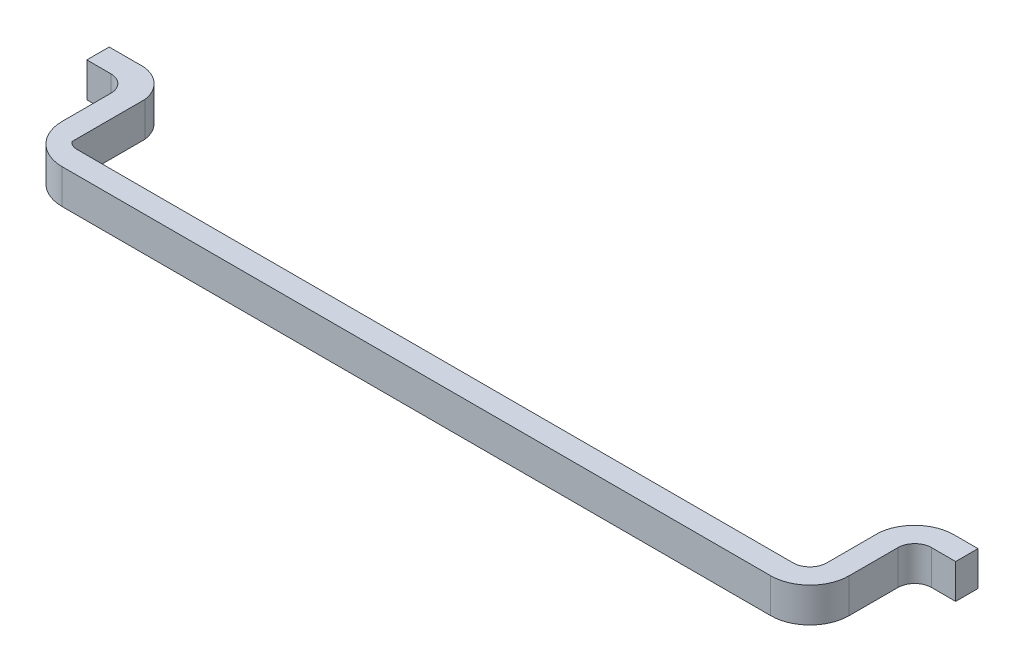
ISO-10303-21;
HEADER;
FILE_DESCRIPTION(('STEP AP214'),'2;1');
FILE_NAME('part.step','',(''),(''),'','','');
FILE_SCHEMA(('AUTOMOTIVE_DESIGN { 1 0 10303 214 1 1 1 1 }'));
ENDSEC;
DATA;
#1=APPLICATION_CONTEXT('core data for automotive mechanical design processes');
#2=APPLICATION_PROTOCOL_DEFINITION('international standard','automotive_design',2000,#1);
#3=PRODUCT_CONTEXT('',#1,'mechanical');
#4=PRODUCT('Part','Part','',(#3));
#5=PRODUCT_RELATED_PRODUCT_CATEGORY('part','',(#4));
#6=PRODUCT_DEFINITION_FORMATION('','',#4);
#7=PRODUCT_DEFINITION_CONTEXT('part definition',#1,'design');
#8=PRODUCT_DEFINITION('design','',#6,#7);
#9=PRODUCT_DEFINITION_SHAPE('','',#8);
#10=(LENGTH_UNIT() NAMED_UNIT(*) SI_UNIT(.MILLI.,.METRE.));
#11=(NAMED_UNIT(*) PLANE_ANGLE_UNIT() SI_UNIT($,.RADIAN.));
#12=(NAMED_UNIT(*) SI_UNIT($,.STERADIAN.) SOLID_ANGLE_UNIT());
#13=UNCERTAINTY_MEASURE_WITH_UNIT(LENGTH_MEASURE(1.E-05),#10,'distance_accuracy_value','');
#14=(GEOMETRIC_REPRESENTATION_CONTEXT(3) GLOBAL_UNCERTAINTY_ASSIGNED_CONTEXT((#13)) GLOBAL_UNIT_ASSIGNED_CONTEXT((#10,
#11,#12)) REPRESENTATION_CONTEXT('',''));
#15=CARTESIAN_POINT('',(0.,0.,0.));
#16=DIRECTION('',(0.,0.,1.));
#17=DIRECTION('',(1.,0.,0.));
#18=AXIS2_PLACEMENT_3D('',#15,#16,#17);
#19=CARTESIAN_POINT('',(36.974920494297,8.449089114766,0.72875));
#20=DIRECTION('',(-1.,0.,0.));
#21=DIRECTION('',(0.,0.,1.));
#22=AXIS2_PLACEMENT_3D('',#19,#20,#21);
#23=PLANE('',#22);
#24=DIRECTION('',(0.,0.,-1.));
#25=VECTOR('',#24,1.);
#26=CARTESIAN_POINT('',(36.974920494297,8.449089114766,1.323992423363));
#27=LINE('',#26,#25);
#28=CARTESIAN_POINT('',(36.974920494297,8.449089114766,1.0425));
#29=VERTEX_POINT('',#28);
#30=CARTESIAN_POINT('',(36.9749205182383,8.449089114766,0.415000215463123));
#31=VERTEX_POINT('',#30);
#32=EDGE_CURVE('E93',#29,#31,#27,.T.);
#33=ORIENTED_EDGE('',*,*,#32,.F.);
#34=DIRECTION('',(0.,-1.,0.));
#35=VECTOR('',#34,1.);
#36=CARTESIAN_POINT('',(36.974920494297,8.449089114766,1.0425));
#37=LINE('',#36,#35);
#38=CARTESIAN_POINT('',(36.974920494297,8.859089114766,1.0425));
#39=VERTEX_POINT('',#38);
#40=EDGE_CURVE('E285',#29,#39,#37,.F.);
#41=ORIENTED_EDGE('',*,*,#40,.T.);
#42=DIRECTION('',(0.,0.,-1.));
#43=VECTOR('',#42,1.);
#44=CARTESIAN_POINT('',(36.974920494297,8.859089114766,1.323992423363));
#45=LINE('',#44,#43);
#46=CARTESIAN_POINT('',(36.9749205182383,8.859089114766,0.415000215463123));
#47=VERTEX_POINT('',#46);
#48=EDGE_CURVE('E318',#39,#47,#45,.T.);
#49=ORIENTED_EDGE('',*,*,#48,.T.);
#50=DIRECTION('',(0.,-1.,0.));
#51=VECTOR('',#50,1.);
#52=CARTESIAN_POINT('',(36.9749205421796,8.449089114766,0.415000005458832));
#53=LINE('',#52,#51);
#54=EDGE_CURVE('E148',#31,#47,#53,.F.);
#55=ORIENTED_EDGE('',*,*,#54,.F.);
#56=EDGE_LOOP('',(#33,#41,#49,#55));
#57=FACE_BOUND('',#56,.T.);
#58=ADVANCED_FACE('F17',(#57),#23,.T.);
#59=CARTESIAN_POINT('',(37.439920494297,8.449089114766,0.468012048193));
#60=DIRECTION('',(0.,-1.,0.));
#61=DIRECTION('',(0.,0.,-1.));
#62=AXIS2_PLACEMENT_3D('',#59,#60,#61);
#63=CYLINDRICAL_SURFACE('',#62,0.468012);
#64=CARTESIAN_POINT('',(37.439920494297,8.449089114766,0.468012048193));
#65=DIRECTION('',(0.,-1.,0.));
#66=DIRECTION('',(0.,0.,-1.));
#67=AXIS2_PLACEMENT_3D('',#64,#65,#66);
#68=CIRCLE('',#67,0.468012);
#69=CARTESIAN_POINT('',(37.439920494297,8.449089114766,0.));
#70=VERTEX_POINT('',#69);
#71=EDGE_CURVE('E20',#31,#70,#68,.T.);
#72=ORIENTED_EDGE('',*,*,#71,.F.);
#73=ORIENTED_EDGE('',*,*,#54,.T.);
#74=CARTESIAN_POINT('',(37.439920494297,8.859089114766,0.468012048193));
#75=DIRECTION('',(0.,-1.,0.));
#76=DIRECTION('',(0.,0.,-1.));
#77=AXIS2_PLACEMENT_3D('',#74,#75,#76);
#78=CIRCLE('',#77,0.468012);
#79=CARTESIAN_POINT('',(37.439920494297,8.859089114766,0.));
#80=VERTEX_POINT('',#79);
#81=EDGE_CURVE('E316',#47,#80,#78,.T.);
#82=ORIENTED_EDGE('',*,*,#81,.T.);
#83=DIRECTION('',(0.,1.,0.));
#84=VECTOR('',#83,1.);
#85=CARTESIAN_POINT('',(37.439920494297,8.449089114766,0.));
#86=LINE('',#85,#84);
#87=EDGE_CURVE('E153',#80,#70,#86,.F.);
#88=ORIENTED_EDGE('',*,*,#87,.T.);
#89=EDGE_LOOP('',(#72,#73,#82,#88));
#90=FACE_BOUND('',#89,.T.);
#91=ADVANCED_FACE('F403',(#90),#63,.T.);
#92=CARTESIAN_POINT('',(37.582420494297,8.449089114766,0.));
#93=DIRECTION('',(0.,0.,1.));
#94=DIRECTION('',(1.,0.,0.));
#95=AXIS2_PLACEMENT_3D('',#92,#93,#94);
#96=PLANE('',#95);
#97=DIRECTION('',(0.,1.,0.));
#98=VECTOR('',#97,1.);
#99=CARTESIAN_POINT('',(37.724920494297,8.449089114766,0.));
#100=LINE('',#99,#98);
#101=CARTESIAN_POINT('',(37.724920494297,8.449089114766,0.));
#102=VERTEX_POINT('',#101);
#103=CARTESIAN_POINT('',(37.724920494297,8.859089114766,0.));
#104=VERTEX_POINT('',#103);
#105=EDGE_CURVE('E159',#102,#104,#100,.T.);
#106=ORIENTED_EDGE('',*,*,#105,.F.);
#107=DIRECTION('',(1.,0.,0.));
#108=VECTOR('',#107,1.);
#109=CARTESIAN_POINT('',(32.574920494297,8.449089114766,0.));
#110=LINE('',#109,#108);
#111=EDGE_CURVE('E102',#70,#102,#110,.T.);
#112=ORIENTED_EDGE('',*,*,#111,.F.);
#113=ORIENTED_EDGE('',*,*,#87,.F.);
#114=DIRECTION('',(1.,0.,0.));
#115=VECTOR('',#114,1.);
#116=CARTESIAN_POINT('',(32.574920494297,8.859089114766,0.));
#117=LINE('',#116,#115);
#118=EDGE_CURVE('E277',#80,#104,#117,.T.);
#119=ORIENTED_EDGE('',*,*,#118,.T.);
#120=EDGE_LOOP('',(#106,#112,#113,#119));
#121=FACE_BOUND('',#120,.T.);
#122=ADVANCED_FACE('F404',(#121),#96,.F.);
#123=CARTESIAN_POINT('',(37.724920494297,8.449089114766,0.1325));
#124=DIRECTION('',(1.,0.,0.));
#125=DIRECTION('',(0.,0.,-1.));
#126=AXIS2_PLACEMENT_3D('',#123,#124,#125);
#127=PLANE('',#126);
#128=DIRECTION('',(0.,0.,-1.));
#129=VECTOR('',#128,1.);
#130=CARTESIAN_POINT('',(37.724920494297,8.449089114766,1.323992423363));
#131=LINE('',#130,#129);
#132=CARTESIAN_POINT('',(37.724920494297,8.449089114766,0.265));
#133=VERTEX_POINT('',#132);
#134=EDGE_CURVE('E226',#102,#133,#131,.F.);
#135=ORIENTED_EDGE('',*,*,#134,.F.);
#136=ORIENTED_EDGE('',*,*,#105,.T.);
#137=DIRECTION('',(0.,0.,-1.));
#138=VECTOR('',#137,1.);
#139=CARTESIAN_POINT('',(37.724920494297,8.859089114766,1.323992423363));
#140=LINE('',#139,#138);
#141=CARTESIAN_POINT('',(37.724920494297,8.859089114766,0.265));
#142=VERTEX_POINT('',#141);
#143=EDGE_CURVE('E274',#104,#142,#140,.F.);
#144=ORIENTED_EDGE('',*,*,#143,.T.);
#145=DIRECTION('',(0.,1.,0.));
#146=VECTOR('',#145,1.);
#147=CARTESIAN_POINT('',(37.724920494297,8.449089114766,0.265));
#148=LINE('',#147,#146);
#149=EDGE_CURVE('E167',#133,#142,#148,.T.);
#150=ORIENTED_EDGE('',*,*,#149,.F.);
#151=EDGE_LOOP('',(#135,#136,#144,#150));
#152=FACE_BOUND('',#151,.T.);
#153=ADVANCED_FACE('F405',(#152),#127,.T.);
#154=CARTESIAN_POINT('',(37.582420494297,8.449089114766,0.265));
#155=DIRECTION('',(0.,0.,1.));
#156=DIRECTION('',(1.,0.,0.));
#157=AXIS2_PLACEMENT_3D('',#154,#155,#156);
#158=PLANE('',#157);
#159=DIRECTION('',(1.,0.,0.));
#160=VECTOR('',#159,1.);
#161=CARTESIAN_POINT('',(32.574920494297,8.449089114766,0.265));
#162=LINE('',#161,#160);
#163=CARTESIAN_POINT('',(37.439920494297,8.449089114766,0.265));
#164=VERTEX_POINT('',#163);
#165=EDGE_CURVE('E224',#133,#164,#162,.F.);
#166=ORIENTED_EDGE('',*,*,#165,.F.);
#167=ORIENTED_EDGE('',*,*,#149,.T.);
#168=DIRECTION('',(1.,0.,0.));
#169=VECTOR('',#168,1.);
#170=CARTESIAN_POINT('',(32.574920494297,8.859089114766,0.265));
#171=LINE('',#170,#169);
#172=CARTESIAN_POINT('',(37.439920494297,8.859089114766,0.265));
#173=VERTEX_POINT('',#172);
#174=EDGE_CURVE('E276',#142,#173,#171,.F.);
#175=ORIENTED_EDGE('',*,*,#174,.T.);
#176=DIRECTION('',(0.,-1.,0.));
#177=VECTOR('',#176,1.);
#178=CARTESIAN_POINT('',(37.439920494297,8.449089114766,0.265));
#179=LINE('',#178,#177);
#180=EDGE_CURVE('E268',#173,#164,#179,.T.);
#181=ORIENTED_EDGE('',*,*,#180,.T.);
#182=EDGE_LOOP('',(#166,#167,#175,#181));
#183=FACE_BOUND('',#182,.T.);
#184=ADVANCED_FACE('F406',(#183),#158,.T.);
#185=CARTESIAN_POINT('',(37.439920494297,8.449089114766,0.465));
#186=DIRECTION('',(0.,-1.,0.));
#187=DIRECTION('',(0.,0.,-1.));
#188=AXIS2_PLACEMENT_3D('',#185,#186,#187);
#189=CYLINDRICAL_SURFACE('',#188,0.2);
#190=DIRECTION('',(0.,1.,0.));
#191=VECTOR('',#190,1.);
#192=CARTESIAN_POINT('',(37.239920494297,8.449089114766,0.465));
#193=LINE('',#192,#191);
#194=CARTESIAN_POINT('',(37.239920494297,8.449089114766,0.465));
#195=VERTEX_POINT('',#194);
#196=CARTESIAN_POINT('',(37.239920494297,8.859089114766,0.465));
#197=VERTEX_POINT('',#196);
#198=EDGE_CURVE('E266',#195,#197,#193,.T.);
#199=ORIENTED_EDGE('',*,*,#198,.F.);
#200=CARTESIAN_POINT('',(37.439920494297,8.449089114766,0.465));
#201=DIRECTION('',(0.,-1.,0.));
#202=DIRECTION('',(0.,0.,-1.));
#203=AXIS2_PLACEMENT_3D('',#200,#201,#202);
#204=CIRCLE('',#203,0.2);
#205=EDGE_CURVE('E223',#164,#195,#204,.F.);
#206=ORIENTED_EDGE('',*,*,#205,.F.);
#207=ORIENTED_EDGE('',*,*,#180,.F.);
#208=CARTESIAN_POINT('',(37.439920494297,8.859089114766,0.465));
#209=DIRECTION('',(0.,-1.,0.));
#210=DIRECTION('',(0.,0.,-1.));
#211=AXIS2_PLACEMENT_3D('',#208,#209,#210);
#212=CIRCLE('',#211,0.2);
#213=EDGE_CURVE('E313',#173,#197,#212,.F.);
#214=ORIENTED_EDGE('',*,*,#213,.T.);
#215=EDGE_LOOP('',(#199,#206,#207,#214));
#216=FACE_BOUND('',#215,.T.);
#217=ADVANCED_FACE('F330',(#216),#189,.F.);
#218=CARTESIAN_POINT('',(37.239920494297,8.449089114766,0.75375));
#219=DIRECTION('',(1.,0.,0.));
#220=DIRECTION('',(0.,0.,-1.));
#221=AXIS2_PLACEMENT_3D('',#218,#219,#220);
#222=PLANE('',#221);
#223=DIRECTION('',(0.,0.,-1.));
#224=VECTOR('',#223,1.);
#225=CARTESIAN_POINT('',(37.239920494297,8.449089114766,1.323992423363));
#226=LINE('',#225,#224);
#227=CARTESIAN_POINT('',(37.239920494297,8.449089114766,1.0425));
#228=VERTEX_POINT('',#227);
#229=EDGE_CURVE('E221',#195,#228,#226,.F.);
#230=ORIENTED_EDGE('',*,*,#229,.F.);
#231=ORIENTED_EDGE('',*,*,#198,.T.);
#232=DIRECTION('',(0.,0.,-1.));
#233=VECTOR('',#232,1.);
#234=CARTESIAN_POINT('',(37.239920494297,8.859089114766,1.323992423363));
#235=LINE('',#234,#233);
#236=CARTESIAN_POINT('',(37.239920494297,8.859089114766,1.0425));
#237=VERTEX_POINT('',#236);
#238=EDGE_CURVE('E312',#197,#237,#235,.F.);
#239=ORIENTED_EDGE('',*,*,#238,.T.);
#240=DIRECTION('',(0.,-1.,0.));
#241=VECTOR('',#240,1.);
#242=CARTESIAN_POINT('',(37.239920494297,8.449089114766,1.0425));
#243=LINE('',#242,#241);
#244=EDGE_CURVE('E264',#228,#237,#243,.F.);
#245=ORIENTED_EDGE('',*,*,#244,.F.);
#246=EDGE_LOOP('',(#230,#231,#239,#245));
#247=FACE_BOUND('',#246,.T.);
#248=ADVANCED_FACE('F335',(#247),#222,.T.);
#249=CARTESIAN_POINT('',(36.774920494297,8.449089114766,1.0425));
#250=DIRECTION('',(0.,-1.,0.));
#251=DIRECTION('',(0.,0.,-1.));
#252=AXIS2_PLACEMENT_3D('',#249,#250,#251);
#253=CYLINDRICAL_SURFACE('',#252,0.465);
#254=CARTESIAN_POINT('',(36.774920494297,8.449089114766,1.0425));
#255=DIRECTION('',(0.,-1.,0.));
#256=DIRECTION('',(0.,0.,-1.));
#257=AXIS2_PLACEMENT_3D('',#254,#255,#256);
#258=CIRCLE('',#257,0.465);
#259=CARTESIAN_POINT('',(36.774920494297,8.449089114766,1.5075));
#260=VERTEX_POINT('',#259);
#261=EDGE_CURVE('E220',#228,#260,#258,.T.);
#262=ORIENTED_EDGE('',*,*,#261,.F.);
#263=ORIENTED_EDGE('',*,*,#244,.T.);
#264=CARTESIAN_POINT('',(36.774920494297,8.859089114766,1.0425));
#265=DIRECTION('',(0.,-1.,0.));
#266=DIRECTION('',(0.,0.,-1.));
#267=AXIS2_PLACEMENT_3D('',#264,#265,#266);
#268=CIRCLE('',#267,0.465);
#269=CARTESIAN_POINT('',(36.774920494297,8.859089114766,1.5075));
#270=VERTEX_POINT('',#269);
#271=EDGE_CURVE('E309',#237,#270,#268,.T.);
#272=ORIENTED_EDGE('',*,*,#271,.T.);
#273=DIRECTION('',(0.,1.,0.));
#274=VECTOR('',#273,1.);
#275=CARTESIAN_POINT('',(36.774920494297,8.449089114766,1.5075));
#276=LINE('',#275,#274);
#277=EDGE_CURVE('E261',#270,#260,#276,.F.);
#278=ORIENTED_EDGE('',*,*,#277,.T.);
#279=EDGE_LOOP('',(#262,#263,#272,#278));
#280=FACE_BOUND('',#279,.T.);
#281=ADVANCED_FACE('F339',(#280),#253,.T.);
#282=CARTESIAN_POINT('',(30.699920494297,8.449089114766,1.5075));
#283=DIRECTION('',(0.,0.,-1.));
#284=DIRECTION('',(-1.,0.,0.));
#285=AXIS2_PLACEMENT_3D('',#282,#283,#284);
#286=PLANE('',#285);
#287=DIRECTION('',(0.,-1.,0.));
#288=VECTOR('',#287,1.);
#289=CARTESIAN_POINT('',(28.374920494297,8.449089114766,1.5075));
#290=LINE('',#289,#288);
#291=CARTESIAN_POINT('',(28.374920494297,8.449089114766,1.5075));
#292=VERTEX_POINT('',#291);
#293=CARTESIAN_POINT('',(28.374920494297,8.859089114766,1.5075));
#294=VERTEX_POINT('',#293);
#295=EDGE_CURVE('E259',#292,#294,#290,.F.);
#296=ORIENTED_EDGE('',*,*,#295,.F.);
#297=DIRECTION('',(1.,0.,0.));
#298=VECTOR('',#297,1.);
#299=CARTESIAN_POINT('',(32.574920494297,8.449089114766,1.5075));
#300=LINE('',#299,#298);
#301=EDGE_CURVE('E218',#260,#292,#300,.F.);
#302=ORIENTED_EDGE('',*,*,#301,.F.);
#303=ORIENTED_EDGE('',*,*,#277,.F.);
#304=DIRECTION('',(1.,0.,0.));
#305=VECTOR('',#304,1.);
#306=CARTESIAN_POINT('',(32.574920494297,8.859089114766,1.5075));
#307=LINE('',#306,#305);
#308=EDGE_CURVE('E308',#270,#294,#307,.F.);
#309=ORIENTED_EDGE('',*,*,#308,.T.);
#310=EDGE_LOOP('',(#296,#302,#303,#309));
#311=FACE_BOUND('',#310,.T.);
#312=ADVANCED_FACE('F345',(#311),#286,.F.);
#313=CARTESIAN_POINT('',(28.374920494297,8.449089114766,1.0425));
#314=DIRECTION('',(0.,-1.,0.));
#315=DIRECTION('',(0.,0.,-1.));
#316=AXIS2_PLACEMENT_3D('',#313,#314,#315);
#317=CYLINDRICAL_SURFACE('',#316,0.465);
#318=CARTESIAN_POINT('',(28.374920494297,8.449089114766,1.0425));
#319=DIRECTION('',(0.,-1.,0.));
#320=DIRECTION('',(0.,0.,-1.));
#321=AXIS2_PLACEMENT_3D('',#318,#319,#320);
#322=CIRCLE('',#321,0.465);
#323=CARTESIAN_POINT('',(27.909920494297,8.449089114766,1.0425));
#324=VERTEX_POINT('',#323);
#325=EDGE_CURVE('E217',#292,#324,#322,.T.);
#326=ORIENTED_EDGE('',*,*,#325,.F.);
#327=ORIENTED_EDGE('',*,*,#295,.T.);
#328=CARTESIAN_POINT('',(28.374920494297,8.859089114766,1.0425));
#329=DIRECTION('',(0.,-1.,0.));
#330=DIRECTION('',(0.,0.,-1.));
#331=AXIS2_PLACEMENT_3D('',#328,#329,#330);
#332=CIRCLE('',#331,0.465);
#333=CARTESIAN_POINT('',(27.909920494297,8.859089114766,1.0425));
#334=VERTEX_POINT('',#333);
#335=EDGE_CURVE('E305',#294,#334,#332,.T.);
#336=ORIENTED_EDGE('',*,*,#335,.T.);
#337=DIRECTION('',(0.,1.,0.));
#338=VECTOR('',#337,1.);
#339=CARTESIAN_POINT('',(27.909920494297,8.449089114766,1.0425));
#340=LINE('',#339,#338);
#341=EDGE_CURVE('E256',#334,#324,#340,.F.);
#342=ORIENTED_EDGE('',*,*,#341,.T.);
#343=EDGE_LOOP('',(#326,#327,#336,#342));
#344=FACE_BOUND('',#343,.T.);
#345=ADVANCED_FACE('F349',(#344),#317,.T.);
#346=CARTESIAN_POINT('',(27.909920494297,8.449089114766,0.75375));
#347=DIRECTION('',(1.,0.,0.));
#348=DIRECTION('',(0.,0.,-1.));
#349=AXIS2_PLACEMENT_3D('',#346,#347,#348);
#350=PLANE('',#349);
#351=DIRECTION('',(0.,-1.,0.));
#352=VECTOR('',#351,1.);
#353=CARTESIAN_POINT('',(27.909920494297,8.449089114766,0.465));
#354=LINE('',#353,#352);
#355=CARTESIAN_POINT('',(27.909920494297,8.859089114766,0.465));
#356=VERTEX_POINT('',#355);
#357=CARTESIAN_POINT('',(27.909920494297,8.449089114766,0.465));
#358=VERTEX_POINT('',#357);
#359=EDGE_CURVE('E253',#356,#358,#354,.T.);
#360=ORIENTED_EDGE('',*,*,#359,.T.);
#361=DIRECTION('',(0.,0.,-1.));
#362=VECTOR('',#361,1.);
#363=CARTESIAN_POINT('',(27.909920494297,8.449089114766,1.323992423363));
#364=LINE('',#363,#362);
#365=EDGE_CURVE('E215',#324,#358,#364,.T.);
#366=ORIENTED_EDGE('',*,*,#365,.F.);
#367=ORIENTED_EDGE('',*,*,#341,.F.);
#368=DIRECTION('',(0.,0.,-1.));
#369=VECTOR('',#368,1.);
#370=CARTESIAN_POINT('',(27.909920494297,8.859089114766,1.323992423363));
#371=LINE('',#370,#369);
#372=EDGE_CURVE('E304',#334,#356,#371,.T.);
#373=ORIENTED_EDGE('',*,*,#372,.T.);
#374=EDGE_LOOP('',(#360,#366,#367,#373));
#375=FACE_BOUND('',#374,.T.);
#376=ADVANCED_FACE('F354',(#375),#350,.F.);
#377=CARTESIAN_POINT('',(27.709920494297,8.449089114766,0.465));
#378=DIRECTION('',(0.,-1.,0.));
#379=DIRECTION('',(0.,0.,-1.));
#380=AXIS2_PLACEMENT_3D('',#377,#378,#379);
#381=CYLINDRICAL_SURFACE('',#380,0.2);
#382=DIRECTION('',(0.,1.,0.));
#383=VECTOR('',#382,1.);
#384=CARTESIAN_POINT('',(27.709920494297,8.449089114766,0.265));
#385=LINE('',#384,#383);
#386=CARTESIAN_POINT('',(27.709920494297,8.859089114766,0.265));
#387=VERTEX_POINT('',#386);
#388=CARTESIAN_POINT('',(27.709920494297,8.449089114766,0.265));
#389=VERTEX_POINT('',#388);
#390=EDGE_CURVE('E248',#387,#389,#385,.F.);
#391=ORIENTED_EDGE('',*,*,#390,.T.);
#392=CARTESIAN_POINT('',(27.709920494297,8.449089114766,0.465));
#393=DIRECTION('',(0.,-1.,0.));
#394=DIRECTION('',(0.,0.,-1.));
#395=AXIS2_PLACEMENT_3D('',#392,#393,#394);
#396=CIRCLE('',#395,0.2);
#397=EDGE_CURVE('E212',#358,#389,#396,.F.);
#398=ORIENTED_EDGE('',*,*,#397,.F.);
#399=ORIENTED_EDGE('',*,*,#359,.F.);
#400=CARTESIAN_POINT('',(27.709920494297,8.859089114766,0.465));
#401=DIRECTION('',(0.,-1.,0.));
#402=DIRECTION('',(0.,0.,-1.));
#403=AXIS2_PLACEMENT_3D('',#400,#401,#402);
#404=CIRCLE('',#403,0.2);
#405=EDGE_CURVE('E301',#356,#387,#404,.F.);
#406=ORIENTED_EDGE('',*,*,#405,.T.);
#407=EDGE_LOOP('',(#391,#398,#399,#406));
#408=FACE_BOUND('',#407,.T.);
#409=ADVANCED_FACE('F357',(#408),#381,.F.);
#410=CARTESIAN_POINT('',(27.567420494297,8.449089114766,0.265));
#411=DIRECTION('',(0.,0.,-1.));
#412=DIRECTION('',(-1.,0.,0.));
#413=AXIS2_PLACEMENT_3D('',#410,#411,#412);
#414=PLANE('',#413);
#415=DIRECTION('',(0.,1.,0.));
#416=VECTOR('',#415,1.);
#417=CARTESIAN_POINT('',(27.424920494297,8.449089114766,0.265));
#418=LINE('',#417,#416);
#419=CARTESIAN_POINT('',(27.424920494297,8.859089114766,0.265));
#420=VERTEX_POINT('',#419);
#421=CARTESIAN_POINT('',(27.424920494297,8.449089114766,0.265));
#422=VERTEX_POINT('',#421);
#423=EDGE_CURVE('E198',#420,#422,#418,.F.);
#424=ORIENTED_EDGE('',*,*,#423,.T.);
#425=DIRECTION('',(1.,0.,0.));
#426=VECTOR('',#425,1.);
#427=CARTESIAN_POINT('',(32.574920494297,8.449089114766,0.265));
#428=LINE('',#427,#426);
#429=EDGE_CURVE('E185',#389,#422,#428,.F.);
#430=ORIENTED_EDGE('',*,*,#429,.F.);
#431=ORIENTED_EDGE('',*,*,#390,.F.);
#432=DIRECTION('',(1.,0.,0.));
#433=VECTOR('',#432,1.);
#434=CARTESIAN_POINT('',(32.574920494297,8.859089114766,0.265));
#435=LINE('',#434,#433);
#436=EDGE_CURVE('E244',#387,#420,#435,.F.);
#437=ORIENTED_EDGE('',*,*,#436,.T.);
#438=EDGE_LOOP('',(#424,#430,#431,#437));
#439=FACE_BOUND('',#438,.T.);
#440=ADVANCED_FACE('F362',(#439),#414,.F.);
#441=CARTESIAN_POINT('',(27.424920494297,8.449089114766,0.1325));
#442=DIRECTION('',(1.,0.,0.));
#443=DIRECTION('',(0.,0.,-1.));
#444=AXIS2_PLACEMENT_3D('',#441,#442,#443);
#445=PLANE('',#444);
#446=DIRECTION('',(0.,1.,0.));
#447=VECTOR('',#446,1.);
#448=CARTESIAN_POINT('',(27.424920494297,8.449089114766,0.));
#449=LINE('',#448,#447);
#450=CARTESIAN_POINT('',(27.424920494297,8.859089114766,0.));
#451=VERTEX_POINT('',#450);
#452=CARTESIAN_POINT('',(27.424920494297,8.449089114766,0.));
#453=VERTEX_POINT('',#452);
#454=EDGE_CURVE('E190',#451,#453,#449,.F.);
#455=ORIENTED_EDGE('',*,*,#454,.T.);
#456=DIRECTION('',(0.,0.,-1.));
#457=VECTOR('',#456,1.);
#458=CARTESIAN_POINT('',(27.424920494297,8.449089114766,1.323992423363));
#459=LINE('',#458,#457);
#460=EDGE_CURVE('E178',#422,#453,#459,.T.);
#461=ORIENTED_EDGE('',*,*,#460,.F.);
#462=ORIENTED_EDGE('',*,*,#423,.F.);
#463=DIRECTION('',(0.,0.,-1.));
#464=VECTOR('',#463,1.);
#465=CARTESIAN_POINT('',(27.424920494297,8.859089114766,1.323992423363));
#466=LINE('',#465,#464);
#467=EDGE_CURVE('E193',#420,#451,#466,.T.);
#468=ORIENTED_EDGE('',*,*,#467,.T.);
#469=EDGE_LOOP('',(#455,#461,#462,#468));
#470=FACE_BOUND('',#469,.T.);
#471=ADVANCED_FACE('F191',(#470),#445,.F.);
#472=CARTESIAN_POINT('',(27.592420494297,8.449089114766,0.));
#473=DIRECTION('',(0.,0.,1.));
#474=DIRECTION('',(1.,0.,0.));
#475=AXIS2_PLACEMENT_3D('',#472,#473,#474);
#476=PLANE('',#475);
#477=DIRECTION('',(0.,-1.,0.));
#478=VECTOR('',#477,1.);
#479=CARTESIAN_POINT('',(27.7599204958936,8.449089114766,1.54309199966451E-08));
#480=LINE('',#479,#478);
#481=CARTESIAN_POINT('',(27.7599205704648,8.449089114766,7.71545999832257E-09));
#482=VERTEX_POINT('',#481);
#483=CARTESIAN_POINT('',(27.7599205704648,8.859089114766,7.71545999832257E-09));
#484=VERTEX_POINT('',#483);
#485=EDGE_CURVE('E197',#482,#484,#480,.F.);
#486=ORIENTED_EDGE('',*,*,#485,.F.);
#487=DIRECTION('',(1.,0.,0.));
#488=VECTOR('',#487,1.);
#489=CARTESIAN_POINT('',(32.574920494297,8.449089114766,0.));
#490=LINE('',#489,#488);
#491=EDGE_CURVE('E182',#453,#482,#490,.T.);
#492=ORIENTED_EDGE('',*,*,#491,.F.);
#493=ORIENTED_EDGE('',*,*,#454,.F.);
#494=DIRECTION('',(1.,0.,0.));
#495=VECTOR('',#494,1.);
#496=CARTESIAN_POINT('',(32.574920494297,8.859089114766,0.));
#497=LINE('',#496,#495);
#498=EDGE_CURVE('E243',#451,#484,#497,.T.);
#499=ORIENTED_EDGE('',*,*,#498,.T.);
#500=EDGE_LOOP('',(#486,#492,#493,#499));
#501=FACE_BOUND('',#500,.T.);
#502=ADVANCED_FACE('F200',(#501),#476,.F.);
#503=CARTESIAN_POINT('',(27.798978002137,8.449089114766,0.377496862239));
#504=DIRECTION('',(0.,-1.,0.));
#505=DIRECTION('',(0.,0.,-1.));
#506=AXIS2_PLACEMENT_3D('',#503,#504,#505);
#507=CYLINDRICAL_SURFACE('',#506,0.379512);
#508=CARTESIAN_POINT('',(27.798978002137,8.449089114766,0.377496862239));
#509=DIRECTION('',(0.,-1.,0.));
#510=DIRECTION('',(0.,0.,-1.));
#511=AXIS2_PLACEMENT_3D('',#508,#509,#510);
#512=CIRCLE('',#511,0.379512);
#513=CARTESIAN_POINT('',(28.174920494297,8.449089114766,0.325568001091064));
#514=VERTEX_POINT('',#513);
#515=EDGE_CURVE('E202',#482,#514,#512,.T.);
#516=ORIENTED_EDGE('',*,*,#515,.F.);
#517=ORIENTED_EDGE('',*,*,#485,.T.);
#518=CARTESIAN_POINT('',(27.798978002137,8.859089114766,0.377496862239));
#519=DIRECTION('',(0.,-1.,0.));
#520=DIRECTION('',(0.,0.,-1.));
#521=AXIS2_PLACEMENT_3D('',#518,#519,#520);
#522=CIRCLE('',#521,0.379512);
#523=CARTESIAN_POINT('',(28.174920494297,8.859089114766,0.325568001091064));
#524=VERTEX_POINT('',#523);
#525=EDGE_CURVE('E298',#484,#524,#522,.T.);
#526=ORIENTED_EDGE('',*,*,#525,.T.);
#527=DIRECTION('',(0.,1.,0.));
#528=VECTOR('',#527,1.);
#529=CARTESIAN_POINT('',(28.174920494297,8.449089114766,0.325567944402));
#530=LINE('',#529,#528);
#531=EDGE_CURVE('E236',#524,#514,#530,.F.);
#532=ORIENTED_EDGE('',*,*,#531,.T.);
#533=EDGE_LOOP('',(#516,#517,#526,#532));
#534=FACE_BOUND('',#533,.T.);
#535=ADVANCED_FACE('F432',(#534),#507,.T.);
#536=CARTESIAN_POINT('',(28.174920494297,8.449089114766,0.759033972201));
#537=DIRECTION('',(-1.,0.,0.));
#538=DIRECTION('',(0.,0.,1.));
#539=AXIS2_PLACEMENT_3D('',#536,#537,#538);
#540=PLANE('',#539);
#541=DIRECTION('',(0.,-1.,0.));
#542=VECTOR('',#541,1.);
#543=CARTESIAN_POINT('',(28.174920494297,8.449089114766,1.1925));
#544=LINE('',#543,#542);
#545=CARTESIAN_POINT('',(28.174920494297,8.859089114766,1.19249999999999));
#546=VERTEX_POINT('',#545);
#547=CARTESIAN_POINT('',(28.174920494297,8.449089114766,1.19249999999999));
#548=VERTEX_POINT('',#547);
#549=EDGE_CURVE('E233',#546,#548,#544,.T.);
#550=ORIENTED_EDGE('',*,*,#549,.T.);
#551=DIRECTION('',(0.,0.,-1.));
#552=VECTOR('',#551,1.);
#553=CARTESIAN_POINT('',(28.174920494297,8.449089114766,1.323992423363));
#554=LINE('',#553,#552);
#555=EDGE_CURVE('E204',#514,#548,#554,.F.);
#556=ORIENTED_EDGE('',*,*,#555,.F.);
#557=ORIENTED_EDGE('',*,*,#531,.F.);
#558=DIRECTION('',(0.,0.,-1.));
#559=VECTOR('',#558,1.);
#560=CARTESIAN_POINT('',(28.174920494297,8.859089114766,1.323992423363));
#561=LINE('',#560,#559);
#562=EDGE_CURVE('E297',#524,#546,#561,.F.);
#563=ORIENTED_EDGE('',*,*,#562,.T.);
#564=EDGE_LOOP('',(#550,#556,#557,#563));
#565=FACE_BOUND('',#564,.T.);
#566=ADVANCED_FACE('F429',(#565),#540,.F.);
#567=CARTESIAN_POINT('',(28.286723893172,8.449089114766,1.0925));
#568=DIRECTION('',(0.,-1.,0.));
#569=DIRECTION('',(0.,0.,-1.));
#570=AXIS2_PLACEMENT_3D('',#567,#568,#569);
#571=CYLINDRICAL_SURFACE('',#570,0.15);
#572=DIRECTION('',(0.,1.,0.));
#573=VECTOR('',#572,1.);
#574=CARTESIAN_POINT('',(28.286723893172,8.449089114766,1.2425));
#575=LINE('',#574,#573);
#576=CARTESIAN_POINT('',(28.286723893172,8.859089114766,1.2425));
#577=VERTEX_POINT('',#576);
#578=CARTESIAN_POINT('',(28.286723893172,8.449089114766,1.2425));
#579=VERTEX_POINT('',#578);
#580=EDGE_CURVE('E296',#577,#579,#575,.F.);
#581=ORIENTED_EDGE('',*,*,#580,.T.);
#582=CARTESIAN_POINT('',(28.286723893172,8.449089114766,1.0925));
#583=DIRECTION('',(0.,-1.,0.));
#584=DIRECTION('',(0.,0.,-1.));
#585=AXIS2_PLACEMENT_3D('',#582,#583,#584);
#586=CIRCLE('',#585,0.15);
#587=EDGE_CURVE('E321',#548,#579,#586,.F.);
#588=ORIENTED_EDGE('',*,*,#587,.F.);
#589=ORIENTED_EDGE('',*,*,#549,.F.);
#590=CARTESIAN_POINT('',(28.286723893172,8.859089114766,1.0925));
#591=DIRECTION('',(0.,-1.,0.));
#592=DIRECTION('',(0.,0.,-1.));
#593=AXIS2_PLACEMENT_3D('',#590,#591,#592);
#594=CIRCLE('',#593,0.15);
#595=EDGE_CURVE('E293',#546,#577,#594,.F.);
#596=ORIENTED_EDGE('',*,*,#595,.T.);
#597=EDGE_LOOP('',(#581,#588,#589,#596));
#598=FACE_BOUND('',#597,.T.);
#599=ADVANCED_FACE('F397',(#598),#571,.F.);
#600=CARTESIAN_POINT('',(32.574920494297,8.449089114766,1.323992423363));
#601=DIRECTION('',(0.,-1.,0.));
#602=DIRECTION('',(0.,0.,-1.));
#603=AXIS2_PLACEMENT_3D('',#600,#601,#602);
#604=PLANE('',#603);
#605=ORIENTED_EDGE('',*,*,#555,.T.);
#606=ORIENTED_EDGE('',*,*,#587,.T.);
#607=DIRECTION('',(1.,0.,0.));
#608=VECTOR('',#607,1.);
#609=CARTESIAN_POINT('',(31.677290909726,8.449089114766,1.2425));
#610=LINE('',#609,#608);
#611=CARTESIAN_POINT('',(36.774920494297,8.449089114766,1.2425));
#612=VERTEX_POINT('',#611);
#613=EDGE_CURVE('E387',#579,#612,#610,.T.);
#614=ORIENTED_EDGE('',*,*,#613,.T.);
#615=CARTESIAN_POINT('',(36.774920494297,8.449089114766,1.0425));
#616=DIRECTION('',(0.,-1.,0.));
#617=DIRECTION('',(0.,0.,-1.));
#618=AXIS2_PLACEMENT_3D('',#615,#616,#617);
#619=CIRCLE('',#618,0.2);
#620=EDGE_CURVE('E286',#612,#29,#619,.F.);
#621=ORIENTED_EDGE('',*,*,#620,.T.);
#622=ORIENTED_EDGE('',*,*,#32,.T.);
#623=ORIENTED_EDGE('',*,*,#71,.T.);
#624=ORIENTED_EDGE('',*,*,#111,.T.);
#625=ORIENTED_EDGE('',*,*,#134,.T.);
#626=ORIENTED_EDGE('',*,*,#165,.T.);
#627=ORIENTED_EDGE('',*,*,#205,.T.);
#628=ORIENTED_EDGE('',*,*,#229,.T.);
#629=ORIENTED_EDGE('',*,*,#261,.T.);
#630=ORIENTED_EDGE('',*,*,#301,.T.);
#631=ORIENTED_EDGE('',*,*,#325,.T.);
#632=ORIENTED_EDGE('',*,*,#365,.T.);
#633=ORIENTED_EDGE('',*,*,#397,.T.);
#634=ORIENTED_EDGE('',*,*,#429,.T.);
#635=ORIENTED_EDGE('',*,*,#460,.T.);
#636=ORIENTED_EDGE('',*,*,#491,.T.);
#637=ORIENTED_EDGE('',*,*,#515,.T.);
#638=EDGE_LOOP('',(#605,#606,#614,#621,#622,#623,#624,#625,#626,#627,#628,#629,#630,#631,#632,
#633,#634,#635,#636,#637));
#639=FACE_BOUND('',#638,.T.);
#640=ADVANCED_FACE('F180',(#639),#604,.T.);
#641=CARTESIAN_POINT('',(36.774920494297,8.449089114766,1.0425));
#642=DIRECTION('',(0.,-1.,0.));
#643=DIRECTION('',(0.,0.,-1.));
#644=AXIS2_PLACEMENT_3D('',#641,#642,#643);
#645=CYLINDRICAL_SURFACE('',#644,0.2);
#646=ORIENTED_EDGE('',*,*,#40,.F.);
#647=ORIENTED_EDGE('',*,*,#620,.F.);
#648=DIRECTION('',(0.,1.,0.));
#649=VECTOR('',#648,1.);
#650=CARTESIAN_POINT('',(36.774920494297,8.449089114766,1.2425));
#651=LINE('',#650,#649);
#652=CARTESIAN_POINT('',(36.774920494297,8.859089114766,1.2425));
#653=VERTEX_POINT('',#652);
#654=EDGE_CURVE('E26',#612,#653,#651,.T.);
#655=ORIENTED_EDGE('',*,*,#654,.T.);
#656=CARTESIAN_POINT('',(36.774920494297,8.859089114766,1.0425));
#657=DIRECTION('',(0.,-1.,0.));
#658=DIRECTION('',(0.,0.,-1.));
#659=AXIS2_PLACEMENT_3D('',#656,#657,#658);
#660=CIRCLE('',#659,0.2);
#661=EDGE_CURVE('E34',#653,#39,#660,.F.);
#662=ORIENTED_EDGE('',*,*,#661,.T.);
#663=EDGE_LOOP('',(#646,#647,#655,#662));
#664=FACE_BOUND('',#663,.T.);
#665=ADVANCED_FACE('F401',(#664),#645,.F.);
#666=CARTESIAN_POINT('',(32.574920494297,8.859089114766,1.323992423363));
#667=DIRECTION('',(0.,-1.,0.));
#668=DIRECTION('',(0.,0.,-1.));
#669=AXIS2_PLACEMENT_3D('',#666,#667,#668);
#670=PLANE('',#669);
#671=ORIENTED_EDGE('',*,*,#595,.F.);
#672=ORIENTED_EDGE('',*,*,#562,.F.);
#673=ORIENTED_EDGE('',*,*,#525,.F.);
#674=ORIENTED_EDGE('',*,*,#498,.F.);
#675=ORIENTED_EDGE('',*,*,#467,.F.);
#676=ORIENTED_EDGE('',*,*,#436,.F.);
#677=ORIENTED_EDGE('',*,*,#405,.F.);
#678=ORIENTED_EDGE('',*,*,#372,.F.);
#679=ORIENTED_EDGE('',*,*,#335,.F.);
#680=ORIENTED_EDGE('',*,*,#308,.F.);
#681=ORIENTED_EDGE('',*,*,#271,.F.);
#682=ORIENTED_EDGE('',*,*,#238,.F.);
#683=ORIENTED_EDGE('',*,*,#213,.F.);
#684=ORIENTED_EDGE('',*,*,#174,.F.);
#685=ORIENTED_EDGE('',*,*,#143,.F.);
#686=ORIENTED_EDGE('',*,*,#118,.F.);
#687=ORIENTED_EDGE('',*,*,#81,.F.);
#688=ORIENTED_EDGE('',*,*,#48,.F.);
#689=ORIENTED_EDGE('',*,*,#661,.F.);
#690=DIRECTION('',(1.,0.,0.));
#691=VECTOR('',#690,1.);
#692=CARTESIAN_POINT('',(31.677290909726,8.859089114766,1.2425));
#693=LINE('',#692,#691);
#694=EDGE_CURVE('E11',#653,#577,#693,.F.);
#695=ORIENTED_EDGE('',*,*,#694,.T.);
#696=EDGE_LOOP('',(#671,#672,#673,#674,#675,#676,#677,#678,#679,#680,#681,#682,#683,#684,#685,
#686,#687,#688,#689,#695));
#697=FACE_BOUND('',#696,.T.);
#698=ADVANCED_FACE('F364',(#697),#670,.F.);
#699=CARTESIAN_POINT('',(31.677290909726,8.449089114766,1.2425));
#700=DIRECTION('',(0.,0.,1.));
#701=DIRECTION('',(1.,0.,0.));
#702=AXIS2_PLACEMENT_3D('',#699,#700,#701);
#703=PLANE('',#702);
#704=ORIENTED_EDGE('',*,*,#654,.F.);
#705=ORIENTED_EDGE('',*,*,#613,.F.);
#706=ORIENTED_EDGE('',*,*,#580,.F.);
#707=ORIENTED_EDGE('',*,*,#694,.F.);
#708=EDGE_LOOP('',(#704,#705,#706,#707));
#709=FACE_BOUND('',#708,.T.);
#710=ADVANCED_FACE('F395',(#709),#703,.F.);
#711=CLOSED_SHELL('',(#58,#91,#122,#153,#184,#217,#248,#281,#312,#345,#376,#409,#440,#471,#502,
#535,#566,#599,#640,#665,#698,#710));
#712=MANIFOLD_SOLID_BREP('B1',#711);
#713=ADVANCED_BREP_SHAPE_REPRESENTATION('',(#18,#712),#14);
#714=SHAPE_DEFINITION_REPRESENTATION(#9,#713);
ENDSEC;
END-ISO-10303-21;
